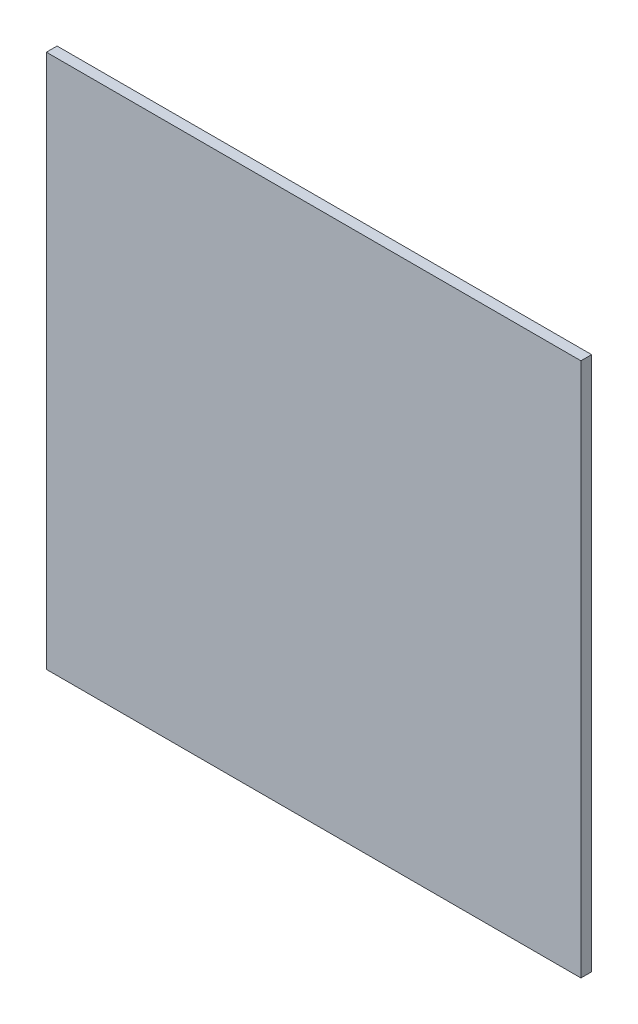
ISO-10303-21;
HEADER;
FILE_DESCRIPTION(('STEP AP214'),'2;1');
FILE_NAME('part.step','',(''),(''),'','','');
FILE_SCHEMA(('AUTOMOTIVE_DESIGN { 1 0 10303 214 1 1 1 1 }'));
ENDSEC;
DATA;
#1=APPLICATION_CONTEXT('core data for automotive mechanical design processes');
#2=APPLICATION_PROTOCOL_DEFINITION('international standard','automotive_design',2000,#1);
#3=PRODUCT_CONTEXT('',#1,'mechanical');
#4=PRODUCT('Part','Part','',(#3));
#5=PRODUCT_RELATED_PRODUCT_CATEGORY('part','',(#4));
#6=PRODUCT_DEFINITION_FORMATION('','',#4);
#7=PRODUCT_DEFINITION_CONTEXT('part definition',#1,'design');
#8=PRODUCT_DEFINITION('design','',#6,#7);
#9=PRODUCT_DEFINITION_SHAPE('','',#8);
#10=(LENGTH_UNIT() NAMED_UNIT(*) SI_UNIT(.MILLI.,.METRE.));
#11=(NAMED_UNIT(*) PLANE_ANGLE_UNIT() SI_UNIT($,.RADIAN.));
#12=(NAMED_UNIT(*) SI_UNIT($,.STERADIAN.) SOLID_ANGLE_UNIT());
#13=UNCERTAINTY_MEASURE_WITH_UNIT(LENGTH_MEASURE(1.E-05),#10,'distance_accuracy_value','');
#14=(GEOMETRIC_REPRESENTATION_CONTEXT(3) GLOBAL_UNCERTAINTY_ASSIGNED_CONTEXT((#13)) GLOBAL_UNIT_ASSIGNED_CONTEXT((#10,
#11,#12)) REPRESENTATION_CONTEXT('',''));
#15=CARTESIAN_POINT('',(0.,0.,0.));
#16=DIRECTION('',(0.,0.,1.));
#17=DIRECTION('',(1.,0.,0.));
#18=AXIS2_PLACEMENT_3D('',#15,#16,#17);
#19=CARTESIAN_POINT('',(-52.7805658884972,43.3352554891258,2.));
#20=DIRECTION('',(1.,0.,0.));
#21=DIRECTION('',(0.,0.,-1.));
#22=AXIS2_PLACEMENT_3D('',#19,#20,#21);
#23=PLANE('',#22);
#24=DIRECTION('',(0.,-1.,0.));
#25=VECTOR('',#24,1.);
#26=CARTESIAN_POINT('',(-52.7805658884972,43.3352554891258,0.));
#27=LINE('',#26,#25);
#28=CARTESIAN_POINT('',(-52.7805658884972,43.3352554891258,0.));
#29=VERTEX_POINT('',#28);
#30=CARTESIAN_POINT('',(-52.7805658884972,-56.6647445108743,0.));
#31=VERTEX_POINT('',#30);
#32=EDGE_CURVE('E98',#29,#31,#27,.T.);
#33=ORIENTED_EDGE('',*,*,#32,.T.);
#34=DIRECTION('',(0.,0.,-1.));
#35=VECTOR('',#34,1.);
#36=CARTESIAN_POINT('',(-52.7805658884972,-56.6647445108743,2.));
#37=LINE('',#36,#35);
#38=CARTESIAN_POINT('',(-52.7805658884972,-56.6647445108743,2.));
#39=VERTEX_POINT('',#38);
#40=EDGE_CURVE('E11',#39,#31,#37,.T.);
#41=ORIENTED_EDGE('',*,*,#40,.F.);
#42=DIRECTION('',(0.,-1.,0.));
#43=VECTOR('',#42,1.);
#44=CARTESIAN_POINT('',(-52.7805658884972,43.3352554891258,2.));
#45=LINE('',#44,#43);
#46=CARTESIAN_POINT('',(-52.7805658884972,43.3352554891258,2.));
#47=VERTEX_POINT('',#46);
#48=EDGE_CURVE('E86',#47,#39,#45,.T.);
#49=ORIENTED_EDGE('',*,*,#48,.F.);
#50=DIRECTION('',(0.,0.,-1.));
#51=VECTOR('',#50,1.);
#52=CARTESIAN_POINT('',(-52.7805658884972,43.3352554891258,2.));
#53=LINE('',#52,#51);
#54=EDGE_CURVE('E94',#47,#29,#53,.T.);
#55=ORIENTED_EDGE('',*,*,#54,.T.);
#56=EDGE_LOOP('',(#33,#41,#49,#55));
#57=FACE_BOUND('',#56,.T.);
#58=ADVANCED_FACE('F35',(#57),#23,.F.);
#59=CARTESIAN_POINT('',(-52.7805658884972,-56.6647445108743,2.));
#60=DIRECTION('',(0.,1.,0.));
#61=DIRECTION('',(0.,0.,1.));
#62=AXIS2_PLACEMENT_3D('',#59,#60,#61);
#63=PLANE('',#62);
#64=DIRECTION('',(1.,0.,0.));
#65=VECTOR('',#64,1.);
#66=CARTESIAN_POINT('',(-52.7805658884972,-56.6647445108743,0.));
#67=LINE('',#66,#65);
#68=CARTESIAN_POINT('',(47.2194341115028,-56.6647445108743,0.));
#69=VERTEX_POINT('',#68);
#70=EDGE_CURVE('E90',#31,#69,#67,.T.);
#71=ORIENTED_EDGE('',*,*,#70,.T.);
#72=DIRECTION('',(0.,0.,-1.));
#73=VECTOR('',#72,1.);
#74=CARTESIAN_POINT('',(47.2194341115028,-56.6647445108743,2.));
#75=LINE('',#74,#73);
#76=CARTESIAN_POINT('',(47.2194341115028,-56.6647445108743,2.));
#77=VERTEX_POINT('',#76);
#78=EDGE_CURVE('E43',#77,#69,#75,.T.);
#79=ORIENTED_EDGE('',*,*,#78,.F.);
#80=DIRECTION('',(1.,0.,0.));
#81=VECTOR('',#80,1.);
#82=CARTESIAN_POINT('',(-52.7805658884972,-56.6647445108743,2.));
#83=LINE('',#82,#81);
#84=EDGE_CURVE('E81',#39,#77,#83,.T.);
#85=ORIENTED_EDGE('',*,*,#84,.F.);
#86=ORIENTED_EDGE('',*,*,#40,.T.);
#87=EDGE_LOOP('',(#71,#79,#85,#86));
#88=FACE_BOUND('',#87,.T.);
#89=ADVANCED_FACE('F89',(#88),#63,.F.);
#90=CARTESIAN_POINT('',(47.2194341115028,43.3352554891258,2.));
#91=DIRECTION('',(-1.,0.,0.));
#92=DIRECTION('',(0.,0.,1.));
#93=AXIS2_PLACEMENT_3D('',#90,#91,#92);
#94=PLANE('',#93);
#95=DIRECTION('',(0.,1.,0.));
#96=VECTOR('',#95,1.);
#97=CARTESIAN_POINT('',(47.2194341115028,43.3352554891258,0.));
#98=LINE('',#97,#96);
#99=CARTESIAN_POINT('',(47.2194341115028,43.3352554891258,0.));
#100=VERTEX_POINT('',#99);
#101=EDGE_CURVE('E68',#69,#100,#98,.T.);
#102=ORIENTED_EDGE('',*,*,#101,.T.);
#103=DIRECTION('',(0.,0.,-1.));
#104=VECTOR('',#103,1.);
#105=CARTESIAN_POINT('',(47.2194341115028,43.3352554891258,2.));
#106=LINE('',#105,#104);
#107=CARTESIAN_POINT('',(47.2194341115028,43.3352554891258,2.));
#108=VERTEX_POINT('',#107);
#109=EDGE_CURVE('E91',#108,#100,#106,.T.);
#110=ORIENTED_EDGE('',*,*,#109,.F.);
#111=DIRECTION('',(0.,1.,0.));
#112=VECTOR('',#111,1.);
#113=CARTESIAN_POINT('',(47.2194341115028,43.3352554891258,2.));
#114=LINE('',#113,#112);
#115=EDGE_CURVE('E84',#77,#108,#114,.T.);
#116=ORIENTED_EDGE('',*,*,#115,.F.);
#117=ORIENTED_EDGE('',*,*,#78,.T.);
#118=EDGE_LOOP('',(#102,#110,#116,#117));
#119=FACE_BOUND('',#118,.T.);
#120=ADVANCED_FACE('F92',(#119),#94,.F.);
#121=CARTESIAN_POINT('',(-52.7805658884972,43.3352554891258,2.));
#122=DIRECTION('',(0.,-1.,0.));
#123=DIRECTION('',(0.,0.,-1.));
#124=AXIS2_PLACEMENT_3D('',#121,#122,#123);
#125=PLANE('',#124);
#126=DIRECTION('',(-1.,0.,0.));
#127=VECTOR('',#126,1.);
#128=CARTESIAN_POINT('',(-52.7805658884972,43.3352554891258,0.));
#129=LINE('',#128,#127);
#130=EDGE_CURVE('E74',#100,#29,#129,.T.);
#131=ORIENTED_EDGE('',*,*,#130,.T.);
#132=ORIENTED_EDGE('',*,*,#54,.F.);
#133=DIRECTION('',(-1.,0.,0.));
#134=VECTOR('',#133,1.);
#135=CARTESIAN_POINT('',(-52.7805658884972,43.3352554891258,2.));
#136=LINE('',#135,#134);
#137=EDGE_CURVE('E51',#108,#47,#136,.T.);
#138=ORIENTED_EDGE('',*,*,#137,.F.);
#139=ORIENTED_EDGE('',*,*,#109,.T.);
#140=EDGE_LOOP('',(#131,#132,#138,#139));
#141=FACE_BOUND('',#140,.T.);
#142=ADVANCED_FACE('F105',(#141),#125,.F.);
#143=CARTESIAN_POINT('',(0.,0.,2.));
#144=DIRECTION('',(0.,0.,1.));
#145=DIRECTION('',(1.,0.,0.));
#146=AXIS2_PLACEMENT_3D('',#143,#144,#145);
#147=PLANE('',#146);
#148=ORIENTED_EDGE('',*,*,#48,.T.);
#149=ORIENTED_EDGE('',*,*,#84,.T.);
#150=ORIENTED_EDGE('',*,*,#115,.T.);
#151=ORIENTED_EDGE('',*,*,#137,.T.);
#152=EDGE_LOOP('',(#148,#149,#150,#151));
#153=FACE_BOUND('',#152,.T.);
#154=ADVANCED_FACE('F82',(#153),#147,.T.);
#155=CARTESIAN_POINT('',(0.,0.,0.));
#156=DIRECTION('',(0.,0.,1.));
#157=DIRECTION('',(1.,0.,0.));
#158=AXIS2_PLACEMENT_3D('',#155,#156,#157);
#159=PLANE('',#158);
#160=ORIENTED_EDGE('',*,*,#32,.F.);
#161=ORIENTED_EDGE('',*,*,#130,.F.);
#162=ORIENTED_EDGE('',*,*,#101,.F.);
#163=ORIENTED_EDGE('',*,*,#70,.F.);
#164=EDGE_LOOP('',(#160,#161,#162,#163));
#165=FACE_BOUND('',#164,.T.);
#166=ADVANCED_FACE('F108',(#165),#159,.F.);
#167=CLOSED_SHELL('',(#58,#89,#120,#142,#154,#166));
#168=MANIFOLD_SOLID_BREP('B2',#167);
#169=ADVANCED_BREP_SHAPE_REPRESENTATION('',(#18,#168),#14);
#170=SHAPE_DEFINITION_REPRESENTATION(#9,#169);
ENDSEC;
END-ISO-10303-21;
